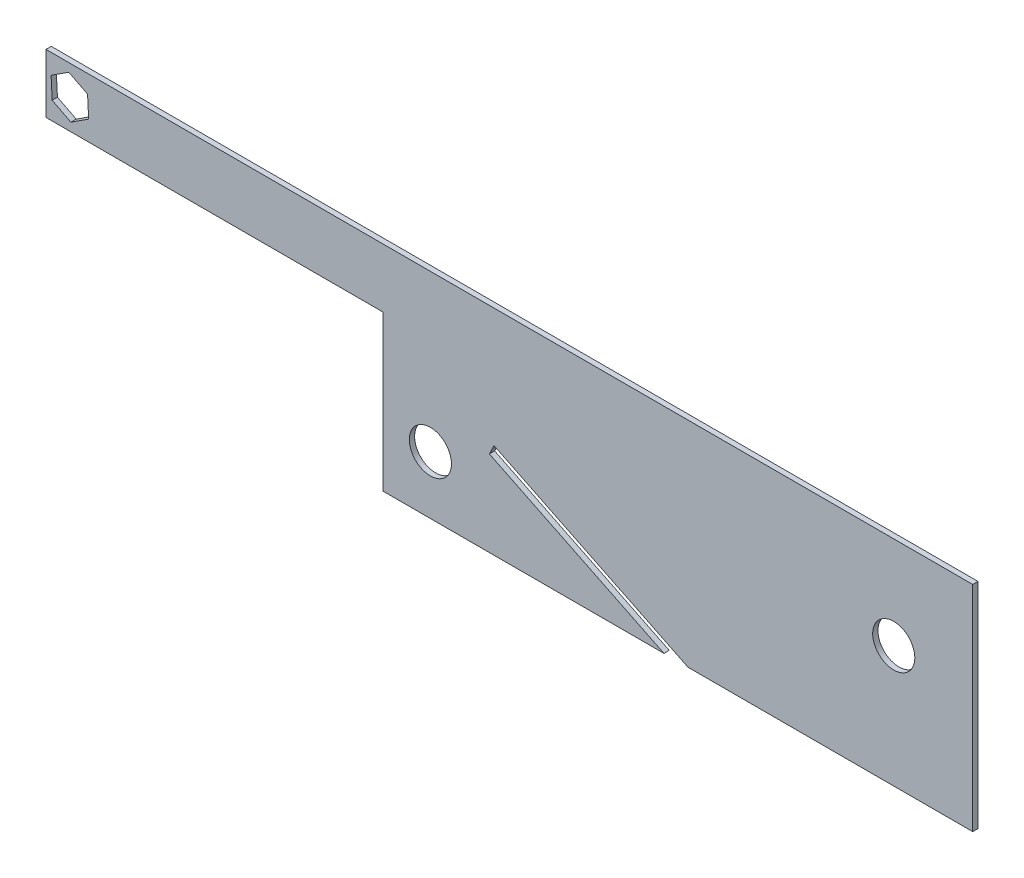
ISO-10303-21;
HEADER;
FILE_DESCRIPTION(('STEP AP214'),'2;1');
FILE_NAME('part.step','',(''),(''),'','','');
FILE_SCHEMA(('AUTOMOTIVE_DESIGN { 1 0 10303 214 1 1 1 1 }'));
ENDSEC;
DATA;
#1=APPLICATION_CONTEXT('core data for automotive mechanical design processes');
#2=APPLICATION_PROTOCOL_DEFINITION('international standard','automotive_design',2000,#1);
#3=PRODUCT_CONTEXT('',#1,'mechanical');
#4=PRODUCT('Part','Part','',(#3));
#5=PRODUCT_RELATED_PRODUCT_CATEGORY('part','',(#4));
#6=PRODUCT_DEFINITION_FORMATION('','',#4);
#7=PRODUCT_DEFINITION_CONTEXT('part definition',#1,'design');
#8=PRODUCT_DEFINITION('design','',#6,#7);
#9=PRODUCT_DEFINITION_SHAPE('','',#8);
#10=(LENGTH_UNIT() NAMED_UNIT(*) SI_UNIT(.MILLI.,.METRE.));
#11=(NAMED_UNIT(*) PLANE_ANGLE_UNIT() SI_UNIT($,.RADIAN.));
#12=(NAMED_UNIT(*) SI_UNIT($,.STERADIAN.) SOLID_ANGLE_UNIT());
#13=UNCERTAINTY_MEASURE_WITH_UNIT(LENGTH_MEASURE(1.E-05),#10,'distance_accuracy_value','');
#14=(GEOMETRIC_REPRESENTATION_CONTEXT(3) GLOBAL_UNCERTAINTY_ASSIGNED_CONTEXT((#13)) GLOBAL_UNIT_ASSIGNED_CONTEXT((#10,
#11,#12)) REPRESENTATION_CONTEXT('',''));
#15=CARTESIAN_POINT('',(0.,0.,0.));
#16=DIRECTION('',(0.,0.,1.));
#17=DIRECTION('',(1.,0.,0.));
#18=AXIS2_PLACEMENT_3D('',#15,#16,#17);
#19=CARTESIAN_POINT('',(232.289747139293,-113.659450591239,3.175));
#20=DIRECTION('',(-0.898238484758988,0.439508389564837,0.));
#21=DIRECTION('',(-0.439508389564837,-0.898238484758989,0.));
#22=AXIS2_PLACEMENT_3D('',#19,#20,#21);
#23=PLANE('',#22);
#24=DIRECTION('',(0.439508389564837,0.898238484758989,0.));
#25=VECTOR('',#24,1.);
#26=CARTESIAN_POINT('',(232.289747139293,-113.659450591239,0.));
#27=LINE('',#26,#25);
#28=CARTESIAN_POINT('',(267.345580387099,-42.0146326853735,0.));
#29=VERTEX_POINT('',#28);
#30=CARTESIAN_POINT('',(270.136458660835,-36.3108183071538,0.));
#31=VERTEX_POINT('',#30);
#32=EDGE_CURVE('E278',#29,#31,#27,.T.);
#33=ORIENTED_EDGE('',*,*,#32,.T.);
#34=DIRECTION('',(0.,0.,-1.));
#35=VECTOR('',#34,1.);
#36=CARTESIAN_POINT('',(270.136458660835,-36.3108183071538,3.175));
#37=LINE('',#36,#35);
#38=CARTESIAN_POINT('',(270.136458660835,-36.3108183071538,3.175));
#39=VERTEX_POINT('',#38);
#40=EDGE_CURVE('E11',#39,#31,#37,.T.);
#41=ORIENTED_EDGE('',*,*,#40,.F.);
#42=DIRECTION('',(0.439508389564837,0.898238484758989,0.));
#43=VECTOR('',#42,1.);
#44=CARTESIAN_POINT('',(232.289747139293,-113.659450591239,3.175));
#45=LINE('',#44,#43);
#46=CARTESIAN_POINT('',(267.345580387099,-42.0146326853735,3.175));
#47=VERTEX_POINT('',#46);
#48=EDGE_CURVE('E191',#47,#39,#45,.T.);
#49=ORIENTED_EDGE('',*,*,#48,.F.);
#50=DIRECTION('',(0.,0.,-1.));
#51=VECTOR('',#50,1.);
#52=CARTESIAN_POINT('',(267.345580387099,-42.0146326853735,3.175));
#53=LINE('',#52,#51);
#54=EDGE_CURVE('E226',#47,#29,#53,.T.);
#55=ORIENTED_EDGE('',*,*,#54,.T.);
#56=EDGE_LOOP('',(#33,#41,#49,#55));
#57=FACE_BOUND('',#56,.T.);
#58=ADVANCED_FACE('F35',(#57),#23,.F.);
#59=CARTESIAN_POINT('',(37.8467115215429,77.3486322840855,3.175));
#60=DIRECTION('',(0.439508389564838,0.898238484758988,0.));
#61=DIRECTION('',(-0.898238484758988,0.439508389564838,0.));
#62=AXIS2_PLACEMENT_3D('',#59,#60,#61);
#63=PLANE('',#62);
#64=DIRECTION('',(0.898238484758988,-0.439508389564838,0.));
#65=VECTOR('',#64,1.);
#66=CARTESIAN_POINT('',(37.8467115215429,77.3486322840855,0.));
#67=LINE('',#66,#65);
#68=CARTESIAN_POINT('',(387.085338562942,-93.5339441688541,0.));
#69=VERTEX_POINT('',#68);
#70=EDGE_CURVE('E281',#31,#69,#67,.T.);
#71=ORIENTED_EDGE('',*,*,#70,.T.);
#72=DIRECTION('',(0.,0.,-1.));
#73=VECTOR('',#72,1.);
#74=CARTESIAN_POINT('',(387.085338562942,-93.5339441688541,3.175));
#75=LINE('',#74,#73);
#76=CARTESIAN_POINT('',(387.085338562942,-93.5339441688541,3.175));
#77=VERTEX_POINT('',#76);
#78=EDGE_CURVE('E45',#77,#69,#75,.T.);
#79=ORIENTED_EDGE('',*,*,#78,.F.);
#80=DIRECTION('',(0.898238484758988,-0.439508389564838,0.));
#81=VECTOR('',#80,1.);
#82=CARTESIAN_POINT('',(37.8467115215429,77.3486322840855,3.175));
#83=LINE('',#82,#81);
#84=EDGE_CURVE('E186',#39,#77,#83,.T.);
#85=ORIENTED_EDGE('',*,*,#84,.F.);
#86=ORIENTED_EDGE('',*,*,#40,.T.);
#87=EDGE_LOOP('',(#71,#79,#85,#86));
#88=FACE_BOUND('',#87,.T.);
#89=ADVANCED_FACE('F315',(#88),#63,.F.);
#90=CARTESIAN_POINT('',(0.,-93.5339441688542,3.175));
#91=DIRECTION('',(0.,-1.,0.));
#92=DIRECTION('',(1.,0.,0.));
#93=AXIS2_PLACEMENT_3D('',#90,#91,#92);
#94=PLANE('',#93);
#95=DIRECTION('',(-1.,0.,0.));
#96=VECTOR('',#95,1.);
#97=CARTESIAN_POINT('',(0.,-93.5339441688542,0.));
#98=LINE('',#97,#96);
#99=CARTESIAN_POINT('',(558.8,-93.5339441688541,0.));
#100=VERTEX_POINT('',#99);
#101=EDGE_CURVE('E222',#100,#69,#98,.T.);
#102=ORIENTED_EDGE('',*,*,#101,.F.);
#103=DIRECTION('',(0.,0.,-1.));
#104=VECTOR('',#103,1.);
#105=CARTESIAN_POINT('',(558.8,-93.5339441688541,3.175));
#106=LINE('',#105,#104);
#107=CARTESIAN_POINT('',(558.8,-93.5339441688541,3.175));
#108=VERTEX_POINT('',#107);
#109=EDGE_CURVE('E236',#108,#100,#106,.T.);
#110=ORIENTED_EDGE('',*,*,#109,.F.);
#111=DIRECTION('',(-1.,0.,0.));
#112=VECTOR('',#111,1.);
#113=CARTESIAN_POINT('',(0.,-93.5339441688542,3.175));
#114=LINE('',#113,#112);
#115=EDGE_CURVE('E179',#108,#77,#114,.T.);
#116=ORIENTED_EDGE('',*,*,#115,.T.);
#117=ORIENTED_EDGE('',*,*,#78,.T.);
#118=EDGE_LOOP('',(#102,#110,#116,#117));
#119=FACE_BOUND('',#118,.T.);
#120=ADVANCED_FACE('F320',(#119),#94,.T.);
#121=CARTESIAN_POINT('',(558.8,0.,3.175));
#122=DIRECTION('',(1.,0.,0.));
#123=DIRECTION('',(0.,0.,-1.));
#124=AXIS2_PLACEMENT_3D('',#121,#122,#123);
#125=PLANE('',#124);
#126=DIRECTION('',(0.,-1.,0.));
#127=VECTOR('',#126,1.);
#128=CARTESIAN_POINT('',(558.8,0.,0.));
#129=LINE('',#128,#127);
#130=CARTESIAN_POINT('',(558.8,35.56,0.));
#131=VERTEX_POINT('',#130);
#132=EDGE_CURVE('E285',#131,#100,#129,.T.);
#133=ORIENTED_EDGE('',*,*,#132,.F.);
#134=DIRECTION('',(0.,0.,-1.));
#135=VECTOR('',#134,1.);
#136=CARTESIAN_POINT('',(558.8,35.56,3.175));
#137=LINE('',#136,#135);
#138=CARTESIAN_POINT('',(558.8,35.56,3.175));
#139=VERTEX_POINT('',#138);
#140=EDGE_CURVE('E234',#139,#131,#137,.T.);
#141=ORIENTED_EDGE('',*,*,#140,.F.);
#142=DIRECTION('',(0.,-1.,0.));
#143=VECTOR('',#142,1.);
#144=CARTESIAN_POINT('',(558.8,0.,3.175));
#145=LINE('',#144,#143);
#146=EDGE_CURVE('E185',#139,#108,#145,.T.);
#147=ORIENTED_EDGE('',*,*,#146,.T.);
#148=ORIENTED_EDGE('',*,*,#109,.T.);
#149=EDGE_LOOP('',(#133,#141,#147,#148));
#150=FACE_BOUND('',#149,.T.);
#151=ADVANCED_FACE('F371',(#150),#125,.T.);
#152=CARTESIAN_POINT('',(0.,35.56,3.175));
#153=DIRECTION('',(0.,1.,0.));
#154=DIRECTION('',(-1.,0.,0.));
#155=AXIS2_PLACEMENT_3D('',#152,#153,#154);
#156=PLANE('',#155);
#157=DIRECTION('',(1.,0.,0.));
#158=VECTOR('',#157,1.);
#159=CARTESIAN_POINT('',(0.,35.56,0.));
#160=LINE('',#159,#158);
#161=CARTESIAN_POINT('',(0.,35.56,0.));
#162=VERTEX_POINT('',#161);
#163=EDGE_CURVE('E288',#162,#131,#160,.T.);
#164=ORIENTED_EDGE('',*,*,#163,.F.);
#165=DIRECTION('',(0.,0.,-1.));
#166=VECTOR('',#165,1.);
#167=CARTESIAN_POINT('',(0.,35.56,3.175));
#168=LINE('',#167,#166);
#169=CARTESIAN_POINT('',(0.,35.56,3.175));
#170=VERTEX_POINT('',#169);
#171=EDGE_CURVE('E232',#170,#162,#168,.T.);
#172=ORIENTED_EDGE('',*,*,#171,.F.);
#173=DIRECTION('',(1.,0.,0.));
#174=VECTOR('',#173,1.);
#175=CARTESIAN_POINT('',(0.,35.56,3.175));
#176=LINE('',#175,#174);
#177=EDGE_CURVE('E190',#170,#139,#176,.T.);
#178=ORIENTED_EDGE('',*,*,#177,.T.);
#179=ORIENTED_EDGE('',*,*,#140,.T.);
#180=EDGE_LOOP('',(#164,#172,#178,#179));
#181=FACE_BOUND('',#180,.T.);
#182=ADVANCED_FACE('F364',(#181),#156,.T.);
#183=CARTESIAN_POINT('',(0.,0.,3.175));
#184=DIRECTION('',(-1.,0.,0.));
#185=DIRECTION('',(0.,0.,1.));
#186=AXIS2_PLACEMENT_3D('',#183,#184,#185);
#187=PLANE('',#186);
#188=DIRECTION('',(0.,1.,0.));
#189=VECTOR('',#188,1.);
#190=CARTESIAN_POINT('',(0.,0.,0.));
#191=LINE('',#190,#189);
#192=CARTESIAN_POINT('',(0.,0.,0.));
#193=VERTEX_POINT('',#192);
#194=EDGE_CURVE('E291',#193,#162,#191,.T.);
#195=ORIENTED_EDGE('',*,*,#194,.F.);
#196=DIRECTION('',(0.,0.,-1.));
#197=VECTOR('',#196,1.);
#198=CARTESIAN_POINT('',(0.,0.,3.175));
#199=LINE('',#198,#197);
#200=CARTESIAN_POINT('',(0.,0.,3.175));
#201=VERTEX_POINT('',#200);
#202=EDGE_CURVE('E230',#201,#193,#199,.T.);
#203=ORIENTED_EDGE('',*,*,#202,.F.);
#204=DIRECTION('',(0.,1.,0.));
#205=VECTOR('',#204,1.);
#206=CARTESIAN_POINT('',(0.,0.,3.175));
#207=LINE('',#206,#205);
#208=EDGE_CURVE('E357',#201,#170,#207,.T.);
#209=ORIENTED_EDGE('',*,*,#208,.T.);
#210=ORIENTED_EDGE('',*,*,#171,.T.);
#211=EDGE_LOOP('',(#195,#203,#209,#210));
#212=FACE_BOUND('',#211,.T.);
#213=ADVANCED_FACE('F368',(#212),#187,.T.);
#214=CARTESIAN_POINT('',(0.,0.,3.175));
#215=DIRECTION('',(0.,1.,0.));
#216=DIRECTION('',(0.,0.,1.));
#217=AXIS2_PLACEMENT_3D('',#214,#215,#216);
#218=PLANE('',#217);
#219=DIRECTION('',(1.,0.,0.));
#220=VECTOR('',#219,1.);
#221=CARTESIAN_POINT('',(0.,0.,0.));
#222=LINE('',#221,#220);
#223=CARTESIAN_POINT('',(203.2,0.,0.));
#224=VERTEX_POINT('',#223);
#225=EDGE_CURVE('E293',#193,#224,#222,.T.);
#226=ORIENTED_EDGE('',*,*,#225,.T.);
#227=DIRECTION('',(0.,0.,-1.));
#228=VECTOR('',#227,1.);
#229=CARTESIAN_POINT('',(203.2,0.,3.175));
#230=LINE('',#229,#228);
#231=CARTESIAN_POINT('',(203.2,0.,3.175));
#232=VERTEX_POINT('',#231);
#233=EDGE_CURVE('E175',#232,#224,#230,.T.);
#234=ORIENTED_EDGE('',*,*,#233,.F.);
#235=DIRECTION('',(1.,0.,0.));
#236=VECTOR('',#235,1.);
#237=CARTESIAN_POINT('',(0.,0.,3.175));
#238=LINE('',#237,#236);
#239=EDGE_CURVE('E162',#201,#232,#238,.T.);
#240=ORIENTED_EDGE('',*,*,#239,.F.);
#241=ORIENTED_EDGE('',*,*,#202,.T.);
#242=EDGE_LOOP('',(#226,#234,#240,#241));
#243=FACE_BOUND('',#242,.T.);
#244=ADVANCED_FACE('F296',(#243),#218,.F.);
#245=CARTESIAN_POINT('',(203.2,0.,3.175));
#246=DIRECTION('',(1.,0.,0.));
#247=DIRECTION('',(0.,0.,-1.));
#248=AXIS2_PLACEMENT_3D('',#245,#246,#247);
#249=PLANE('',#248);
#250=DIRECTION('',(0.,-1.,0.));
#251=VECTOR('',#250,1.);
#252=CARTESIAN_POINT('',(203.2,0.,0.));
#253=LINE('',#252,#251);
#254=CARTESIAN_POINT('',(203.2,-93.5339441688542,0.));
#255=VERTEX_POINT('',#254);
#256=EDGE_CURVE('E171',#224,#255,#253,.T.);
#257=ORIENTED_EDGE('',*,*,#256,.T.);
#258=DIRECTION('',(0.,0.,-1.));
#259=VECTOR('',#258,1.);
#260=CARTESIAN_POINT('',(203.2,-93.5339441688542,3.175));
#261=LINE('',#260,#259);
#262=CARTESIAN_POINT('',(203.2,-93.5339441688542,3.175));
#263=VERTEX_POINT('',#262);
#264=EDGE_CURVE('E168',#263,#255,#261,.T.);
#265=ORIENTED_EDGE('',*,*,#264,.F.);
#266=DIRECTION('',(0.,-1.,0.));
#267=VECTOR('',#266,1.);
#268=CARTESIAN_POINT('',(203.2,0.,3.175));
#269=LINE('',#268,#267);
#270=EDGE_CURVE('E155',#232,#263,#269,.T.);
#271=ORIENTED_EDGE('',*,*,#270,.F.);
#272=ORIENTED_EDGE('',*,*,#233,.T.);
#273=EDGE_LOOP('',(#257,#265,#271,#272));
#274=FACE_BOUND('',#273,.T.);
#275=ADVANCED_FACE('F169',(#274),#249,.F.);
#276=CARTESIAN_POINT('',(372.637377725864,-93.5339441688541,0.));
#277=VERTEX_POINT('',#276);
#278=EDGE_CURVE('E219',#277,#255,#98,.T.);
#279=ORIENTED_EDGE('',*,*,#278,.F.);
#280=DIRECTION('',(0.,0.,-1.));
#281=VECTOR('',#280,1.);
#282=CARTESIAN_POINT('',(372.637377725864,-93.5339441688541,3.175));
#283=LINE('',#282,#281);
#284=CARTESIAN_POINT('',(372.637377725864,-93.5339441688541,3.175));
#285=VERTEX_POINT('',#284);
#286=EDGE_CURVE('E106',#285,#277,#283,.T.);
#287=ORIENTED_EDGE('',*,*,#286,.F.);
#288=EDGE_CURVE('E159',#285,#263,#114,.T.);
#289=ORIENTED_EDGE('',*,*,#288,.T.);
#290=ORIENTED_EDGE('',*,*,#264,.T.);
#291=EDGE_LOOP('',(#279,#287,#289,#290));
#292=FACE_BOUND('',#291,.T.);
#293=ADVANCED_FACE('F177',(#292),#94,.T.);
#294=CARTESIAN_POINT('',(2.1240264446375,-3.2805566751715,3.175));
#295=DIRECTION('',(-0.543488125790368,0.83941685539717,0.));
#296=DIRECTION('',(-0.83941685539717,-0.543488125790368,0.));
#297=AXIS2_PLACEMENT_3D('',#294,#295,#296);
#298=PLANE('',#297);
#299=DIRECTION('',(0.83941685539717,0.543488125790368,0.));
#300=VECTOR('',#299,1.);
#301=CARTESIAN_POINT('',(2.1240264446375,-3.2805566751715,0.));
#302=LINE('',#301,#300);
#303=CARTESIAN_POINT('',(15.0368976935472,5.08,0.));
#304=VERTEX_POINT('',#303);
#305=CARTESIAN_POINT('',(25.7113644645356,11.9912812089425,0.));
#306=VERTEX_POINT('',#305);
#307=EDGE_CURVE('E256',#304,#306,#302,.T.);
#308=ORIENTED_EDGE('',*,*,#307,.F.);
#309=DIRECTION('',(0.,0.,-1.));
#310=VECTOR('',#309,1.);
#311=CARTESIAN_POINT('',(15.0368976935472,5.08,3.175));
#312=LINE('',#311,#310);
#313=CARTESIAN_POINT('',(15.0368976935472,5.08,3.175));
#314=VERTEX_POINT('',#313);
#315=EDGE_CURVE('E39',#314,#304,#312,.T.);
#316=ORIENTED_EDGE('',*,*,#315,.F.);
#317=DIRECTION('',(0.83941685539717,0.543488125790368,0.));
#318=VECTOR('',#317,1.);
#319=CARTESIAN_POINT('',(2.1240264446375,-3.2805566751715,3.175));
#320=LINE('',#319,#318);
#321=CARTESIAN_POINT('',(25.7113644645356,11.9912812089425,3.175));
#322=VERTEX_POINT('',#321);
#323=EDGE_CURVE('E210',#314,#322,#320,.T.);
#324=ORIENTED_EDGE('',*,*,#323,.T.);
#325=DIRECTION('',(0.,0.,-1.));
#326=VECTOR('',#325,1.);
#327=CARTESIAN_POINT('',(25.7113644645356,11.9912812089425,3.175));
#328=LINE('',#327,#326);
#329=EDGE_CURVE('E180',#322,#306,#328,.T.);
#330=ORIENTED_EDGE('',*,*,#329,.T.);
#331=EDGE_LOOP('',(#308,#316,#324,#330));
#332=FACE_BOUND('',#331,.T.);
#333=ADVANCED_FACE('F257',(#332),#298,.T.);
#334=CARTESIAN_POINT('',(5.17491010297604,10.1219851765795,3.175));
#335=DIRECTION('',(0.455212258243613,0.890382951288237,0.));
#336=DIRECTION('',(-0.890382951288237,0.455212258243613,0.));
#337=AXIS2_PLACEMENT_3D('',#334,#335,#336);
#338=PLANE('',#337);
#339=DIRECTION('',(0.890382951288237,-0.455212258243613,0.));
#340=VECTOR('',#339,1.);
#341=CARTESIAN_POINT('',(5.17491010297604,10.1219851765795,0.));
#342=LINE('',#341,#340);
#343=CARTESIAN_POINT('',(3.71431920841083,10.8687187910575,0.));
#344=VERTEX_POINT('',#343);
#345=EDGE_CURVE('E252',#344,#304,#342,.T.);
#346=ORIENTED_EDGE('',*,*,#345,.F.);
#347=DIRECTION('',(0.,0.,-1.));
#348=VECTOR('',#347,1.);
#349=CARTESIAN_POINT('',(3.71431920841083,10.8687187910575,3.175));
#350=LINE('',#349,#348);
#351=CARTESIAN_POINT('',(3.71431920841083,10.8687187910575,3.175));
#352=VERTEX_POINT('',#351);
#353=EDGE_CURVE('E245',#352,#344,#350,.T.);
#354=ORIENTED_EDGE('',*,*,#353,.F.);
#355=DIRECTION('',(0.890382951288237,-0.455212258243613,0.));
#356=VECTOR('',#355,1.);
#357=CARTESIAN_POINT('',(5.17491010297604,10.1219851765795,3.175));
#358=LINE('',#357,#356);
#359=EDGE_CURVE('E207',#352,#314,#358,.T.);
#360=ORIENTED_EDGE('',*,*,#359,.T.);
#361=ORIENTED_EDGE('',*,*,#315,.T.);
#362=EDGE_LOOP('',(#346,#354,#360,#361));
#363=FACE_BOUND('',#362,.T.);
#364=ADVANCED_FACE('F250',(#363),#338,.T.);
#365=CARTESIAN_POINT('',(4.25788736464489,0.217290289649543,3.175));
#366=DIRECTION('',(0.998700384033982,0.0509660958910669,0.));
#367=DIRECTION('',(-0.0509660958910669,0.998700384033982,0.));
#368=AXIS2_PLACEMENT_3D('',#365,#366,#367);
#369=PLANE('',#368);
#370=DIRECTION('',(0.0509660958910669,-0.998700384033982,0.));
#371=VECTOR('',#370,1.);
#372=CARTESIAN_POINT('',(4.25788736464489,0.217290289649543,0.));
#373=LINE('',#372,#371);
#374=CARTESIAN_POINT('',(3.06620749426281,23.5687187910575,0.));
#375=VERTEX_POINT('',#374);
#376=EDGE_CURVE('E266',#375,#344,#373,.T.);
#377=ORIENTED_EDGE('',*,*,#376,.F.);
#378=DIRECTION('',(0.,0.,-1.));
#379=VECTOR('',#378,1.);
#380=CARTESIAN_POINT('',(3.06620749426281,23.5687187910575,3.175));
#381=LINE('',#380,#379);
#382=CARTESIAN_POINT('',(3.06620749426281,23.5687187910575,3.175));
#383=VERTEX_POINT('',#382);
#384=EDGE_CURVE('E244',#383,#375,#381,.T.);
#385=ORIENTED_EDGE('',*,*,#384,.F.);
#386=DIRECTION('',(0.0509660958910669,-0.998700384033982,0.));
#387=VECTOR('',#386,1.);
#388=CARTESIAN_POINT('',(4.25788736464489,0.217290289649543,3.175));
#389=LINE('',#388,#387);
#390=EDGE_CURVE('E204',#383,#352,#389,.T.);
#391=ORIENTED_EDGE('',*,*,#390,.T.);
#392=ORIENTED_EDGE('',*,*,#353,.T.);
#393=EDGE_LOOP('',(#377,#385,#391,#392));
#394=FACE_BOUND('',#393,.T.);
#395=ADVANCED_FACE('F336',(#394),#369,.T.);
#396=CARTESIAN_POINT('',(-9.8466637546469,15.208162115886,3.175));
#397=DIRECTION('',(0.543488125790368,-0.839416855397169,0.));
#398=DIRECTION('',(0.83941685539717,0.543488125790368,0.));
#399=AXIS2_PLACEMENT_3D('',#396,#397,#398);
#400=PLANE('',#399);
#401=DIRECTION('',(-0.83941685539717,-0.543488125790368,0.));
#402=VECTOR('',#401,1.);
#403=CARTESIAN_POINT('',(-9.8466637546469,15.208162115886,0.));
#404=LINE('',#403,#402);
#405=CARTESIAN_POINT('',(13.7406742652512,30.48,0.));
#406=VERTEX_POINT('',#405);
#407=EDGE_CURVE('E268',#406,#375,#404,.T.);
#408=ORIENTED_EDGE('',*,*,#407,.F.);
#409=DIRECTION('',(0.,0.,-1.));
#410=VECTOR('',#409,1.);
#411=CARTESIAN_POINT('',(13.7406742652512,30.48,3.175));
#412=LINE('',#411,#410);
#413=CARTESIAN_POINT('',(13.7406742652512,30.48,3.175));
#414=VERTEX_POINT('',#413);
#415=EDGE_CURVE('E242',#414,#406,#412,.T.);
#416=ORIENTED_EDGE('',*,*,#415,.F.);
#417=DIRECTION('',(-0.83941685539717,-0.543488125790368,0.));
#418=VECTOR('',#417,1.);
#419=CARTESIAN_POINT('',(-9.8466637546469,15.208162115886,3.175));
#420=LINE('',#419,#418);
#421=EDGE_CURVE('E201',#414,#383,#420,.T.);
#422=ORIENTED_EDGE('',*,*,#421,.T.);
#423=ORIENTED_EDGE('',*,*,#384,.T.);
#424=EDGE_LOOP('',(#408,#416,#422,#423));
#425=FACE_BOUND('',#424,.T.);
#426=ADVANCED_FACE('F332',(#425),#400,.T.);
#427=CARTESIAN_POINT('',(15.2012651598164,29.733266385522,3.175));
#428=DIRECTION('',(-0.455212258243613,-0.890382951288236,0.));
#429=DIRECTION('',(0.890382951288237,-0.455212258243613,0.));
#430=AXIS2_PLACEMENT_3D('',#427,#428,#429);
#431=PLANE('',#430);
#432=DIRECTION('',(-0.890382951288236,0.455212258243613,0.));
#433=VECTOR('',#432,1.);
#434=CARTESIAN_POINT('',(15.2012651598164,29.733266385522,0.));
#435=LINE('',#434,#433);
#436=CARTESIAN_POINT('',(25.0632527503876,24.6912812089425,0.));
#437=VERTEX_POINT('',#436);
#438=EDGE_CURVE('E273',#437,#406,#435,.T.);
#439=ORIENTED_EDGE('',*,*,#438,.F.);
#440=DIRECTION('',(0.,0.,-1.));
#441=VECTOR('',#440,1.);
#442=CARTESIAN_POINT('',(25.0632527503876,24.6912812089425,3.175));
#443=LINE('',#442,#441);
#444=CARTESIAN_POINT('',(25.0632527503876,24.6912812089425,3.175));
#445=VERTEX_POINT('',#444);
#446=EDGE_CURVE('E240',#445,#437,#443,.T.);
#447=ORIENTED_EDGE('',*,*,#446,.F.);
#448=DIRECTION('',(-0.890382951288236,0.455212258243613,0.));
#449=VECTOR('',#448,1.);
#450=CARTESIAN_POINT('',(15.2012651598164,29.733266385522,3.175));
#451=LINE('',#450,#449);
#452=EDGE_CURVE('E198',#445,#414,#451,.T.);
#453=ORIENTED_EDGE('',*,*,#452,.T.);
#454=ORIENTED_EDGE('',*,*,#415,.T.);
#455=EDGE_LOOP('',(#439,#447,#453,#454));
#456=FACE_BOUND('',#455,.T.);
#457=ADVANCED_FACE('F328',(#456),#431,.T.);
#458=CARTESIAN_POINT('',(26.2549326207696,1.33985270753448,3.175));
#459=DIRECTION('',(-0.998700384033982,-0.0509660958910671,0.));
#460=DIRECTION('',(0.0509660958910671,-0.998700384033982,0.));
#461=AXIS2_PLACEMENT_3D('',#458,#459,#460);
#462=PLANE('',#461);
#463=DIRECTION('',(-0.0509660958910671,0.998700384033982,0.));
#464=VECTOR('',#463,1.);
#465=CARTESIAN_POINT('',(26.2549326207696,1.33985270753448,0.));
#466=LINE('',#465,#464);
#467=EDGE_CURVE('E276',#306,#437,#466,.T.);
#468=ORIENTED_EDGE('',*,*,#467,.F.);
#469=ORIENTED_EDGE('',*,*,#329,.F.);
#470=DIRECTION('',(-0.0509660958910671,0.998700384033982,0.));
#471=VECTOR('',#470,1.);
#472=CARTESIAN_POINT('',(26.2549326207696,1.33985270753448,3.175));
#473=LINE('',#472,#471);
#474=EDGE_CURVE('E193',#322,#445,#473,.T.);
#475=ORIENTED_EDGE('',*,*,#474,.T.);
#476=ORIENTED_EDGE('',*,*,#446,.T.);
#477=EDGE_LOOP('',(#468,#469,#475,#476));
#478=FACE_BOUND('',#477,.T.);
#479=ADVANCED_FACE('F325',(#478),#462,.T.);
#480=CARTESIAN_POINT('',(511.175,-20.248310314719,3.175));
#481=DIRECTION('',(0.,0.,-1.));
#482=DIRECTION('',(-1.,0.,0.));
#483=AXIS2_PLACEMENT_3D('',#480,#481,#482);
#484=CYLINDRICAL_SURFACE('',#483,12.7);
#485=CARTESIAN_POINT('',(511.175,-20.248310314719,3.175));
#486=DIRECTION('',(0.,0.,1.));
#487=DIRECTION('',(1.,0.,0.));
#488=AXIS2_PLACEMENT_3D('',#485,#486,#487);
#489=CIRCLE('',#488,12.7);
#490=CARTESIAN_POINT('',(523.875,-20.248310314719,3.175));
#491=VERTEX_POINT('',#490);
#492=EDGE_CURVE('E212',#491,#491,#489,.T.);
#493=ORIENTED_EDGE('',*,*,#492,.T.);
#494=EDGE_LOOP('',(#493));
#495=FACE_BOUND('',#494,.T.);
#496=CARTESIAN_POINT('',(511.175,-20.248310314719,0.));
#497=DIRECTION('',(0.,0.,1.));
#498=DIRECTION('',(1.,0.,0.));
#499=AXIS2_PLACEMENT_3D('',#496,#497,#498);
#500=CIRCLE('',#499,12.7);
#501=CARTESIAN_POINT('',(523.875,-20.248310314719,0.));
#502=VERTEX_POINT('',#501);
#503=EDGE_CURVE('E261',#502,#502,#500,.T.);
#504=ORIENTED_EDGE('',*,*,#503,.F.);
#505=EDGE_LOOP('',(#504));
#506=FACE_BOUND('',#505,.T.);
#507=ADVANCED_FACE('F311',(#495,#506),#484,.F.);
#508=CARTESIAN_POINT('',(231.775,-58.6089441688542,3.175));
#509=DIRECTION('',(0.,0.,-1.));
#510=DIRECTION('',(-1.,0.,0.));
#511=AXIS2_PLACEMENT_3D('',#508,#509,#510);
#512=CYLINDRICAL_SURFACE('',#511,12.7);
#513=CARTESIAN_POINT('',(231.775,-58.6089441688542,3.175));
#514=DIRECTION('',(0.,0.,1.));
#515=DIRECTION('',(1.,0.,0.));
#516=AXIS2_PLACEMENT_3D('',#513,#514,#515);
#517=CIRCLE('',#516,12.7);
#518=CARTESIAN_POINT('',(244.475,-58.6089441688542,3.175));
#519=VERTEX_POINT('',#518);
#520=EDGE_CURVE('E215',#519,#519,#517,.T.);
#521=ORIENTED_EDGE('',*,*,#520,.T.);
#522=EDGE_LOOP('',(#521));
#523=FACE_BOUND('',#522,.T.);
#524=CARTESIAN_POINT('',(231.775,-58.6089441688542,0.));
#525=DIRECTION('',(0.,0.,1.));
#526=DIRECTION('',(1.,0.,0.));
#527=AXIS2_PLACEMENT_3D('',#524,#525,#526);
#528=CIRCLE('',#527,12.7);
#529=CARTESIAN_POINT('',(244.475,-58.6089441688542,0.));
#530=VERTEX_POINT('',#529);
#531=EDGE_CURVE('E352',#530,#530,#528,.T.);
#532=ORIENTED_EDGE('',*,*,#531,.F.);
#533=EDGE_LOOP('',(#532));
#534=FACE_BOUND('',#533,.T.);
#535=ADVANCED_FACE('F37',(#523,#534),#512,.F.);
#536=CARTESIAN_POINT('',(35.055833247806,71.6448179058657,3.175));
#537=DIRECTION('',(-0.439508389564837,-0.898238484758988,0.));
#538=DIRECTION('',(0.898238484758988,-0.439508389564837,0.));
#539=AXIS2_PLACEMENT_3D('',#536,#537,#538);
#540=PLANE('',#539);
#541=DIRECTION('',(-0.898238484758988,0.439508389564837,0.));
#542=VECTOR('',#541,1.);
#543=CARTESIAN_POINT('',(35.055833247806,71.6448179058657,0.));
#544=LINE('',#543,#542);
#545=EDGE_CURVE('E109',#277,#29,#544,.T.);
#546=ORIENTED_EDGE('',*,*,#545,.T.);
#547=ORIENTED_EDGE('',*,*,#54,.F.);
#548=DIRECTION('',(-0.898238484758988,0.439508389564837,0.));
#549=VECTOR('',#548,1.);
#550=CARTESIAN_POINT('',(35.055833247806,71.6448179058657,3.175));
#551=LINE('',#550,#549);
#552=EDGE_CURVE('E54',#285,#47,#551,.T.);
#553=ORIENTED_EDGE('',*,*,#552,.F.);
#554=ORIENTED_EDGE('',*,*,#286,.T.);
#555=EDGE_LOOP('',(#546,#547,#553,#554));
#556=FACE_BOUND('',#555,.T.);
#557=ADVANCED_FACE('F302',(#556),#540,.F.);
#558=CARTESIAN_POINT('',(0.,0.,3.175));
#559=DIRECTION('',(0.,0.,1.));
#560=DIRECTION('',(1.,0.,0.));
#561=AXIS2_PLACEMENT_3D('',#558,#559,#560);
#562=PLANE('',#561);
#563=ORIENTED_EDGE('',*,*,#520,.F.);
#564=EDGE_LOOP('',(#563));
#565=FACE_BOUND('',#564,.T.);
#566=ORIENTED_EDGE('',*,*,#492,.F.);
#567=EDGE_LOOP('',(#566));
#568=FACE_BOUND('',#567,.T.);
#569=ORIENTED_EDGE('',*,*,#323,.F.);
#570=ORIENTED_EDGE('',*,*,#359,.F.);
#571=ORIENTED_EDGE('',*,*,#390,.F.);
#572=ORIENTED_EDGE('',*,*,#421,.F.);
#573=ORIENTED_EDGE('',*,*,#452,.F.);
#574=ORIENTED_EDGE('',*,*,#474,.F.);
#575=EDGE_LOOP('',(#569,#570,#571,#572,#573,#574));
#576=FACE_BOUND('',#575,.T.);
#577=ORIENTED_EDGE('',*,*,#48,.T.);
#578=ORIENTED_EDGE('',*,*,#84,.T.);
#579=ORIENTED_EDGE('',*,*,#115,.F.);
#580=ORIENTED_EDGE('',*,*,#146,.F.);
#581=ORIENTED_EDGE('',*,*,#177,.F.);
#582=ORIENTED_EDGE('',*,*,#208,.F.);
#583=ORIENTED_EDGE('',*,*,#239,.T.);
#584=ORIENTED_EDGE('',*,*,#270,.T.);
#585=ORIENTED_EDGE('',*,*,#288,.F.);
#586=ORIENTED_EDGE('',*,*,#552,.T.);
#587=EDGE_LOOP('',(#577,#578,#579,#580,#581,#582,#583,#584,#585,#586));
#588=FACE_BOUND('',#587,.T.);
#589=ADVANCED_FACE('F157',(#565,#568,#576,#588),#562,.T.);
#590=CARTESIAN_POINT('',(0.,0.,0.));
#591=DIRECTION('',(0.,0.,1.));
#592=DIRECTION('',(1.,0.,0.));
#593=AXIS2_PLACEMENT_3D('',#590,#591,#592);
#594=PLANE('',#593);
#595=ORIENTED_EDGE('',*,*,#531,.T.);
#596=EDGE_LOOP('',(#595));
#597=FACE_BOUND('',#596,.T.);
#598=ORIENTED_EDGE('',*,*,#503,.T.);
#599=EDGE_LOOP('',(#598));
#600=FACE_BOUND('',#599,.T.);
#601=ORIENTED_EDGE('',*,*,#307,.T.);
#602=ORIENTED_EDGE('',*,*,#467,.T.);
#603=ORIENTED_EDGE('',*,*,#438,.T.);
#604=ORIENTED_EDGE('',*,*,#407,.T.);
#605=ORIENTED_EDGE('',*,*,#376,.T.);
#606=ORIENTED_EDGE('',*,*,#345,.T.);
#607=EDGE_LOOP('',(#601,#602,#603,#604,#605,#606));
#608=FACE_BOUND('',#607,.T.);
#609=ORIENTED_EDGE('',*,*,#32,.F.);
#610=ORIENTED_EDGE('',*,*,#545,.F.);
#611=ORIENTED_EDGE('',*,*,#278,.T.);
#612=ORIENTED_EDGE('',*,*,#256,.F.);
#613=ORIENTED_EDGE('',*,*,#225,.F.);
#614=ORIENTED_EDGE('',*,*,#194,.T.);
#615=ORIENTED_EDGE('',*,*,#163,.T.);
#616=ORIENTED_EDGE('',*,*,#132,.T.);
#617=ORIENTED_EDGE('',*,*,#101,.T.);
#618=ORIENTED_EDGE('',*,*,#70,.F.);
#619=EDGE_LOOP('',(#609,#610,#611,#612,#613,#614,#615,#616,#617,#618));
#620=FACE_BOUND('',#619,.T.);
#621=ADVANCED_FACE('F263',(#597,#600,#608,#620),#594,.F.);
#622=CLOSED_SHELL('',(#58,#89,#120,#151,#182,#213,#244,#275,#293,#333,#364,#395,#426,#457,#479,
#507,#535,#557,#589,#621));
#623=MANIFOLD_SOLID_BREP('B2',#622);
#624=ADVANCED_BREP_SHAPE_REPRESENTATION('',(#18,#623),#14);
#625=SHAPE_DEFINITION_REPRESENTATION(#9,#624);
ENDSEC;
END-ISO-10303-21;
